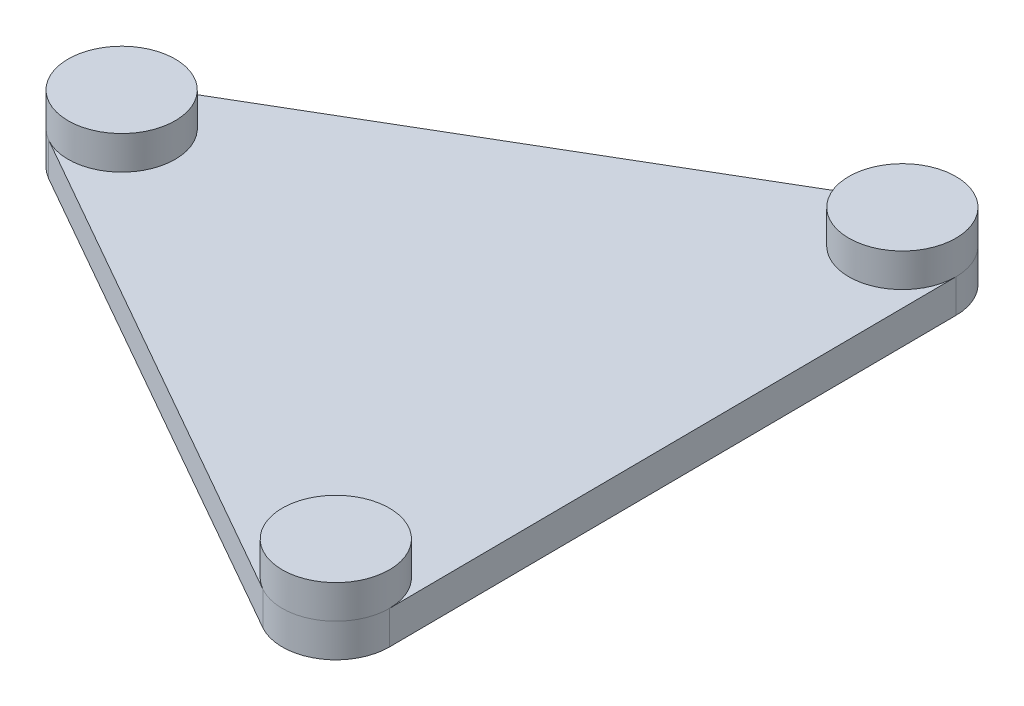
ISO-10303-21;
HEADER;
FILE_DESCRIPTION(('STEP AP214'),'2;1');
FILE_NAME('part.step','',(''),(''),'','','');
FILE_SCHEMA(('AUTOMOTIVE_DESIGN { 1 0 10303 214 1 1 1 1 }'));
ENDSEC;
DATA;
#1=APPLICATION_CONTEXT('core data for automotive mechanical design processes');
#2=APPLICATION_PROTOCOL_DEFINITION('international standard','automotive_design',2000,#1);
#3=PRODUCT_CONTEXT('',#1,'mechanical');
#4=PRODUCT('Part','Part','',(#3));
#5=PRODUCT_RELATED_PRODUCT_CATEGORY('part','',(#4));
#6=PRODUCT_DEFINITION_FORMATION('','',#4);
#7=PRODUCT_DEFINITION_CONTEXT('part definition',#1,'design');
#8=PRODUCT_DEFINITION('design','',#6,#7);
#9=PRODUCT_DEFINITION_SHAPE('','',#8);
#10=(LENGTH_UNIT() NAMED_UNIT(*) SI_UNIT(.MILLI.,.METRE.));
#11=(NAMED_UNIT(*) PLANE_ANGLE_UNIT() SI_UNIT($,.RADIAN.));
#12=(NAMED_UNIT(*) SI_UNIT($,.STERADIAN.) SOLID_ANGLE_UNIT());
#13=UNCERTAINTY_MEASURE_WITH_UNIT(LENGTH_MEASURE(1.E-05),#10,'distance_accuracy_value','');
#14=(GEOMETRIC_REPRESENTATION_CONTEXT(3) GLOBAL_UNCERTAINTY_ASSIGNED_CONTEXT((#13)) GLOBAL_UNIT_ASSIGNED_CONTEXT((#10,
#11,#12)) REPRESENTATION_CONTEXT('',''));
#15=CARTESIAN_POINT('',(0.,0.,0.));
#16=DIRECTION('',(0.,0.,1.));
#17=DIRECTION('',(1.,0.,0.));
#18=AXIS2_PLACEMENT_3D('',#15,#16,#17);
#19=CARTESIAN_POINT('',(0.,6.35,0.));
#20=DIRECTION('',(0.,1.,0.));
#21=DIRECTION('',(0.,0.,1.));
#22=AXIS2_PLACEMENT_3D('',#19,#20,#21);
#23=PLANE('',#22);
#24=DIRECTION('',(0.869445593483827,0.,0.494028703590749));
#25=VECTOR('',#24,1.);
#26=CARTESIAN_POINT('',(-82.8535753576031,6.35,0.570161201162794));
#27=LINE('',#26,#25);
#28=CARTESIAN_POINT('',(-67.5533881035216,6.35,9.26389860173108));
#29=VERTEX_POINT('',#28);
#30=CARTESIAN_POINT('',(26.620374509179,6.35,62.7744830529028));
#31=VERTEX_POINT('',#30);
#32=EDGE_CURVE('E113',#29,#31,#27,.T.);
#33=ORIENTED_EDGE('',*,*,#32,.T.);
#34=CARTESIAN_POINT('',(31.6397061376607,6.35,53.9409158231076));
#35=DIRECTION('',(0.,1.,0.));
#36=DIRECTION('',(0.,0.,1.));
#37=AXIS2_PLACEMENT_3D('',#34,#35,#36);
#38=CIRCLE('',#37,10.16);
#39=CARTESIAN_POINT('',(41.7994655789425,6.35,53.8710009084939));
#40=VERTEX_POINT('',#39);
#41=EDGE_CURVE('E97',#40,#31,#38,.T.);
#42=ORIENTED_EDGE('',*,*,#41,.F.);
#43=DIRECTION('',(-0.00688138923363167,0.,-0.999976322960807));
#44=VECTOR('',#43,1.);
#45=CARTESIAN_POINT('',(41.9205617632608,6.35,71.4682204534712));
#46=LINE('',#45,#44);
#47=CARTESIAN_POINT('',(41.0541097786604,6.35,-54.4411621096563));
#48=VERTEX_POINT('',#47);
#49=EDGE_CURVE('E110',#40,#48,#46,.T.);
#50=ORIENTED_EDGE('',*,*,#49,.T.);
#51=CARTESIAN_POINT('',(30.8943503373786,6.35,-54.3712471950426));
#52=DIRECTION('',(0.,1.,0.));
#53=DIRECTION('',(0.,0.,1.));
#54=AXIS2_PLACEMENT_3D('',#51,#52,#53);
#55=CIRCLE('',#54,10.16);
#56=CARTESIAN_POINT('',(25.7539225245787,6.35,-63.1348995102248));
#57=VERTEX_POINT('',#56);
#58=EDGE_CURVE('E104',#48,#57,#55,.F.);
#59=ORIENTED_EDGE('',*,*,#58,.T.);
#60=DIRECTION('',(-0.862564204250195,0.,0.505947619370057));
#61=VECTOR('',#60,1.);
#62=CARTESIAN_POINT('',(40.9330135943423,6.35,-72.0383816546341));
#63=LINE('',#62,#61);
#64=CARTESIAN_POINT('',(-67.6744842878393,6.35,-8.3333209432466));
#65=VERTEX_POINT('',#64);
#66=EDGE_CURVE('E125',#57,#65,#63,.T.);
#67=ORIENTED_EDGE('',*,*,#66,.T.);
#68=CARTESIAN_POINT('',(-62.5340564750396,6.35,0.430331371935391));
#69=DIRECTION('',(0.,1.,0.));
#70=DIRECTION('',(0.,0.,1.));
#71=AXIS2_PLACEMENT_3D('',#68,#69,#70);
#72=CIRCLE('',#71,10.16);
#73=EDGE_CURVE('E154',#29,#65,#72,.T.);
#74=ORIENTED_EDGE('',*,*,#73,.F.);
#75=EDGE_LOOP('',(#33,#42,#50,#59,#67,#74));
#76=FACE_BOUND('',#75,.T.);
#77=ADVANCED_FACE('F39',(#76),#23,.T.);
#78=CARTESIAN_POINT('',(41.9205617632608,6.35,71.4682204534712));
#79=DIRECTION('',(-0.999976322960806,0.,0.00688138923363167));
#80=DIRECTION('',(0.00688138923363168,0.,0.999976322960807));
#81=AXIS2_PLACEMENT_3D('',#78,#79,#80);
#82=PLANE('',#81);
#83=DIRECTION('',(-0.00688138923363167,0.,-0.999976322960807));
#84=VECTOR('',#83,1.);
#85=CARTESIAN_POINT('',(41.9205617632608,0.,71.4682204534712));
#86=LINE('',#85,#84);
#87=CARTESIAN_POINT('',(41.799465578943,0.,53.8710009084936));
#88=VERTEX_POINT('',#87);
#89=CARTESIAN_POINT('',(41.0541097786601,0.,-54.4411621096564));
#90=VERTEX_POINT('',#89);
#91=EDGE_CURVE('E149',#88,#90,#86,.T.);
#92=ORIENTED_EDGE('',*,*,#91,.T.);
#93=DIRECTION('',(0.,-1.,0.));
#94=VECTOR('',#93,1.);
#95=CARTESIAN_POINT('',(41.0541097786601,6.35,-54.4411621096564));
#96=LINE('',#95,#94);
#97=EDGE_CURVE('E123',#90,#48,#96,.F.);
#98=ORIENTED_EDGE('',*,*,#97,.T.);
#99=ORIENTED_EDGE('',*,*,#49,.F.);
#100=DIRECTION('',(0.,-1.,0.));
#101=VECTOR('',#100,1.);
#102=CARTESIAN_POINT('',(41.799465578943,6.35,53.8710009084936));
#103=LINE('',#102,#101);
#104=EDGE_CURVE('E121',#40,#88,#103,.T.);
#105=ORIENTED_EDGE('',*,*,#104,.T.);
#106=EDGE_LOOP('',(#92,#98,#99,#105));
#107=FACE_BOUND('',#106,.T.);
#108=ADVANCED_FACE('F120',(#107),#82,.F.);
#109=CARTESIAN_POINT('',(40.9330135943423,6.35,-72.0383816546341));
#110=DIRECTION('',(0.505947619370057,0.,0.862564204250195));
#111=DIRECTION('',(0.862564204250195,0.,-0.505947619370057));
#112=AXIS2_PLACEMENT_3D('',#109,#110,#111);
#113=PLANE('',#112);
#114=ORIENTED_EDGE('',*,*,#66,.F.);
#115=DIRECTION('',(0.,-1.,0.));
#116=VECTOR('',#115,1.);
#117=CARTESIAN_POINT('',(25.7539225245785,6.35,-63.1348995102247));
#118=LINE('',#117,#116);
#119=CARTESIAN_POINT('',(25.7539225245785,0.,-63.1348995102247));
#120=VERTEX_POINT('',#119);
#121=EDGE_CURVE('E158',#57,#120,#118,.T.);
#122=ORIENTED_EDGE('',*,*,#121,.T.);
#123=DIRECTION('',(-0.862564204250195,0.,0.505947619370057));
#124=VECTOR('',#123,1.);
#125=CARTESIAN_POINT('',(40.9330135943423,0.,-72.0383816546341));
#126=LINE('',#125,#124);
#127=CARTESIAN_POINT('',(-67.6744842878393,0.,-8.33332094324658));
#128=VERTEX_POINT('',#127);
#129=EDGE_CURVE('E146',#120,#128,#126,.T.);
#130=ORIENTED_EDGE('',*,*,#129,.T.);
#131=DIRECTION('',(0.,-1.,0.));
#132=VECTOR('',#131,1.);
#133=CARTESIAN_POINT('',(-67.6744842878393,6.35,-8.33332094324658));
#134=LINE('',#133,#132);
#135=EDGE_CURVE('E103',#128,#65,#134,.F.);
#136=ORIENTED_EDGE('',*,*,#135,.T.);
#137=EDGE_LOOP('',(#114,#122,#130,#136));
#138=FACE_BOUND('',#137,.T.);
#139=ADVANCED_FACE('F213',(#138),#113,.F.);
#140=CARTESIAN_POINT('',(-82.8535753576031,6.35,0.570161201162794));
#141=DIRECTION('',(0.494028703590749,0.,-0.869445593483827));
#142=DIRECTION('',(-0.869445593483827,0.,-0.494028703590749));
#143=AXIS2_PLACEMENT_3D('',#140,#141,#142);
#144=PLANE('',#143);
#145=DIRECTION('',(0.869445593483827,0.,0.494028703590749));
#146=VECTOR('',#145,1.);
#147=CARTESIAN_POINT('',(-82.8535753576031,0.,0.570161201162794));
#148=LINE('',#147,#146);
#149=CARTESIAN_POINT('',(-67.5533881035216,0.,9.26389860173108));
#150=VERTEX_POINT('',#149);
#151=CARTESIAN_POINT('',(26.6203745091792,0.,62.7744830529029));
#152=VERTEX_POINT('',#151);
#153=EDGE_CURVE('E126',#150,#152,#148,.T.);
#154=ORIENTED_EDGE('',*,*,#153,.T.);
#155=DIRECTION('',(0.,-1.,0.));
#156=VECTOR('',#155,1.);
#157=CARTESIAN_POINT('',(26.6203745091792,6.35,62.774483052903));
#158=LINE('',#157,#156);
#159=EDGE_CURVE('E11',#152,#31,#158,.F.);
#160=ORIENTED_EDGE('',*,*,#159,.T.);
#161=ORIENTED_EDGE('',*,*,#32,.F.);
#162=DIRECTION('',(0.,-1.,0.));
#163=VECTOR('',#162,1.);
#164=CARTESIAN_POINT('',(-67.5533881035216,6.35,9.26389860173108));
#165=LINE('',#164,#163);
#166=EDGE_CURVE('E48',#29,#150,#165,.T.);
#167=ORIENTED_EDGE('',*,*,#166,.T.);
#168=EDGE_LOOP('',(#154,#160,#161,#167));
#169=FACE_BOUND('',#168,.T.);
#170=ADVANCED_FACE('F139',(#169),#144,.F.);
#171=CARTESIAN_POINT('',(0.,0.,0.));
#172=DIRECTION('',(0.,1.,0.));
#173=DIRECTION('',(0.,0.,1.));
#174=AXIS2_PLACEMENT_3D('',#171,#172,#173);
#175=PLANE('',#174);
#176=ORIENTED_EDGE('',*,*,#129,.F.);
#177=CARTESIAN_POINT('',(30.8943503373783,0.,-54.3712471950427));
#178=DIRECTION('',(0.,1.,0.));
#179=DIRECTION('',(0.,0.,1.));
#180=AXIS2_PLACEMENT_3D('',#177,#178,#179);
#181=CIRCLE('',#180,10.16);
#182=EDGE_CURVE('E130',#120,#90,#181,.F.);
#183=ORIENTED_EDGE('',*,*,#182,.T.);
#184=ORIENTED_EDGE('',*,*,#91,.F.);
#185=CARTESIAN_POINT('',(31.6397061376612,0.,53.9409158231073));
#186=DIRECTION('',(0.,1.,0.));
#187=DIRECTION('',(0.,0.,1.));
#188=AXIS2_PLACEMENT_3D('',#185,#186,#187);
#189=CIRCLE('',#188,10.16);
#190=EDGE_CURVE('E55',#88,#152,#189,.F.);
#191=ORIENTED_EDGE('',*,*,#190,.T.);
#192=ORIENTED_EDGE('',*,*,#153,.F.);
#193=CARTESIAN_POINT('',(-62.5340564750396,0.,0.430331371935398));
#194=DIRECTION('',(0.,1.,0.));
#195=DIRECTION('',(0.,0.,1.));
#196=AXIS2_PLACEMENT_3D('',#193,#194,#195);
#197=CIRCLE('',#196,10.16);
#198=EDGE_CURVE('E63',#150,#128,#197,.F.);
#199=ORIENTED_EDGE('',*,*,#198,.T.);
#200=EDGE_LOOP('',(#176,#183,#184,#191,#192,#199));
#201=FACE_BOUND('',#200,.T.);
#202=ADVANCED_FACE('F143',(#201),#175,.F.);
#203=CARTESIAN_POINT('',(-62.5340564750396,12.7,0.430331371935391));
#204=DIRECTION('',(0.,-1.,0.));
#205=DIRECTION('',(0.,0.,-1.));
#206=AXIS2_PLACEMENT_3D('',#203,#204,#205);
#207=CYLINDRICAL_SURFACE('',#206,10.16);
#208=CARTESIAN_POINT('',(-62.5340564750396,12.7,0.430331371935391));
#209=DIRECTION('',(0.,1.,0.));
#210=DIRECTION('',(0.,0.,1.));
#211=AXIS2_PLACEMENT_3D('',#208,#209,#210);
#212=CIRCLE('',#211,10.16);
#213=CARTESIAN_POINT('',(-62.5340564750396,12.7,10.5903313719354));
#214=VERTEX_POINT('',#213);
#215=EDGE_CURVE('E175',#214,#214,#212,.T.);
#216=ORIENTED_EDGE('',*,*,#215,.F.);
#217=EDGE_LOOP('',(#216));
#218=FACE_BOUND('',#217,.T.);
#219=EDGE_CURVE('E168',#65,#29,#72,.T.);
#220=ORIENTED_EDGE('',*,*,#219,.T.);
#221=ORIENTED_EDGE('',*,*,#73,.T.);
#222=EDGE_LOOP('',(#220,#221));
#223=FACE_BOUND('',#222,.T.);
#224=ADVANCED_FACE('F217',(#218,#223),#207,.T.);
#225=CARTESIAN_POINT('',(-62.5340564750396,12.7,0.430331371935391));
#226=DIRECTION('',(0.,1.,0.));
#227=DIRECTION('',(0.,0.,1.));
#228=AXIS2_PLACEMENT_3D('',#225,#226,#227);
#229=PLANE('',#228);
#230=ORIENTED_EDGE('',*,*,#215,.T.);
#231=EDGE_LOOP('',(#230));
#232=FACE_BOUND('',#231,.T.);
#233=ADVANCED_FACE('F236',(#232),#229,.T.);
#234=CARTESIAN_POINT('',(30.8943503373786,12.7,-54.3712471950426));
#235=DIRECTION('',(0.,-1.,0.));
#236=DIRECTION('',(0.,0.,-1.));
#237=AXIS2_PLACEMENT_3D('',#234,#235,#236);
#238=CYLINDRICAL_SURFACE('',#237,10.16);
#239=CARTESIAN_POINT('',(30.8943503373786,12.7,-54.3712471950426));
#240=DIRECTION('',(0.,1.,0.));
#241=DIRECTION('',(0.,0.,1.));
#242=AXIS2_PLACEMENT_3D('',#239,#240,#241);
#243=CIRCLE('',#242,10.16);
#244=CARTESIAN_POINT('',(30.8943503373786,12.7,-44.2112471950426));
#245=VERTEX_POINT('',#244);
#246=EDGE_CURVE('E182',#245,#245,#243,.T.);
#247=ORIENTED_EDGE('',*,*,#246,.F.);
#248=EDGE_LOOP('',(#247));
#249=FACE_BOUND('',#248,.T.);
#250=CARTESIAN_POINT('',(30.8943503373786,6.35,-54.3712471950426));
#251=DIRECTION('',(0.,1.,0.));
#252=DIRECTION('',(0.,0.,1.));
#253=AXIS2_PLACEMENT_3D('',#250,#251,#252);
#254=CIRCLE('',#253,10.16);
#255=EDGE_CURVE('E184',#48,#57,#254,.T.);
#256=ORIENTED_EDGE('',*,*,#255,.T.);
#257=ORIENTED_EDGE('',*,*,#58,.F.);
#258=EDGE_LOOP('',(#256,#257));
#259=FACE_BOUND('',#258,.T.);
#260=ADVANCED_FACE('F205',(#249,#259),#238,.T.);
#261=CARTESIAN_POINT('',(30.8943503373786,12.7,-54.3712471950426));
#262=DIRECTION('',(0.,1.,0.));
#263=DIRECTION('',(0.,0.,1.));
#264=AXIS2_PLACEMENT_3D('',#261,#262,#263);
#265=PLANE('',#264);
#266=ORIENTED_EDGE('',*,*,#246,.T.);
#267=EDGE_LOOP('',(#266));
#268=FACE_BOUND('',#267,.T.);
#269=ADVANCED_FACE('F197',(#268),#265,.T.);
#270=CARTESIAN_POINT('',(31.6397061376607,12.7,53.9409158231076));
#271=DIRECTION('',(0.,-1.,0.));
#272=DIRECTION('',(0.,0.,-1.));
#273=AXIS2_PLACEMENT_3D('',#270,#271,#272);
#274=CYLINDRICAL_SURFACE('',#273,10.16);
#275=CARTESIAN_POINT('',(31.6397061376607,12.7,53.9409158231076));
#276=DIRECTION('',(0.,1.,0.));
#277=DIRECTION('',(0.,0.,1.));
#278=AXIS2_PLACEMENT_3D('',#275,#276,#277);
#279=CIRCLE('',#278,10.16);
#280=CARTESIAN_POINT('',(31.6397061376607,12.7,64.1009158231076));
#281=VERTEX_POINT('',#280);
#282=EDGE_CURVE('E115',#281,#281,#279,.T.);
#283=ORIENTED_EDGE('',*,*,#282,.F.);
#284=EDGE_LOOP('',(#283));
#285=FACE_BOUND('',#284,.T.);
#286=ORIENTED_EDGE('',*,*,#41,.T.);
#287=CARTESIAN_POINT('',(31.6397061376607,6.35,53.9409158231076));
#288=DIRECTION('',(0.,1.,0.));
#289=DIRECTION('',(0.,0.,1.));
#290=AXIS2_PLACEMENT_3D('',#287,#288,#289);
#291=CIRCLE('',#290,10.16);
#292=EDGE_CURVE('E94',#40,#31,#291,.F.);
#293=ORIENTED_EDGE('',*,*,#292,.F.);
#294=EDGE_LOOP('',(#286,#293));
#295=FACE_BOUND('',#294,.T.);
#296=ADVANCED_FACE('F96',(#285,#295),#274,.T.);
#297=CARTESIAN_POINT('',(31.6397061376607,12.7,53.9409158231076));
#298=DIRECTION('',(0.,1.,0.));
#299=DIRECTION('',(0.,0.,1.));
#300=AXIS2_PLACEMENT_3D('',#297,#298,#299);
#301=PLANE('',#300);
#302=ORIENTED_EDGE('',*,*,#282,.T.);
#303=EDGE_LOOP('',(#302));
#304=FACE_BOUND('',#303,.T.);
#305=ADVANCED_FACE('F194',(#304),#301,.T.);
#306=CARTESIAN_POINT('',(30.8943503373783,6.35,-54.3712471950427));
#307=DIRECTION('',(0.,-1.,0.));
#308=DIRECTION('',(0.,0.,-1.));
#309=AXIS2_PLACEMENT_3D('',#306,#307,#308);
#310=CYLINDRICAL_SURFACE('',#309,10.16);
#311=ORIENTED_EDGE('',*,*,#255,.F.);
#312=ORIENTED_EDGE('',*,*,#97,.F.);
#313=ORIENTED_EDGE('',*,*,#182,.F.);
#314=ORIENTED_EDGE('',*,*,#121,.F.);
#315=EDGE_LOOP('',(#311,#312,#313,#314));
#316=FACE_BOUND('',#315,.T.);
#317=ADVANCED_FACE('F203',(#316),#310,.T.);
#318=CARTESIAN_POINT('',(31.6397061376612,6.35,53.9409158231073));
#319=DIRECTION('',(0.,-1.,0.));
#320=DIRECTION('',(0.,0.,-1.));
#321=AXIS2_PLACEMENT_3D('',#318,#319,#320);
#322=CYLINDRICAL_SURFACE('',#321,10.16);
#323=ORIENTED_EDGE('',*,*,#292,.T.);
#324=ORIENTED_EDGE('',*,*,#159,.F.);
#325=ORIENTED_EDGE('',*,*,#190,.F.);
#326=ORIENTED_EDGE('',*,*,#104,.F.);
#327=EDGE_LOOP('',(#323,#324,#325,#326));
#328=FACE_BOUND('',#327,.T.);
#329=ADVANCED_FACE('F128',(#328),#322,.T.);
#330=CARTESIAN_POINT('',(-62.5340564750396,6.35,0.430331371935398));
#331=DIRECTION('',(0.,-1.,0.));
#332=DIRECTION('',(0.,0.,-1.));
#333=AXIS2_PLACEMENT_3D('',#330,#331,#332);
#334=CYLINDRICAL_SURFACE('',#333,10.16);
#335=ORIENTED_EDGE('',*,*,#219,.F.);
#336=ORIENTED_EDGE('',*,*,#135,.F.);
#337=ORIENTED_EDGE('',*,*,#198,.F.);
#338=ORIENTED_EDGE('',*,*,#166,.F.);
#339=EDGE_LOOP('',(#335,#336,#337,#338));
#340=FACE_BOUND('',#339,.T.);
#341=ADVANCED_FACE('F41',(#340),#334,.T.);
#342=CLOSED_SHELL('',(#77,#108,#139,#170,#202,#224,#233,#260,#269,#296,#305,#317,#329,#341));
#343=MANIFOLD_SOLID_BREP('B2',#342);
#344=ADVANCED_BREP_SHAPE_REPRESENTATION('',(#18,#343),#14);
#345=SHAPE_DEFINITION_REPRESENTATION(#9,#344);
ENDSEC;
END-ISO-10303-21;
